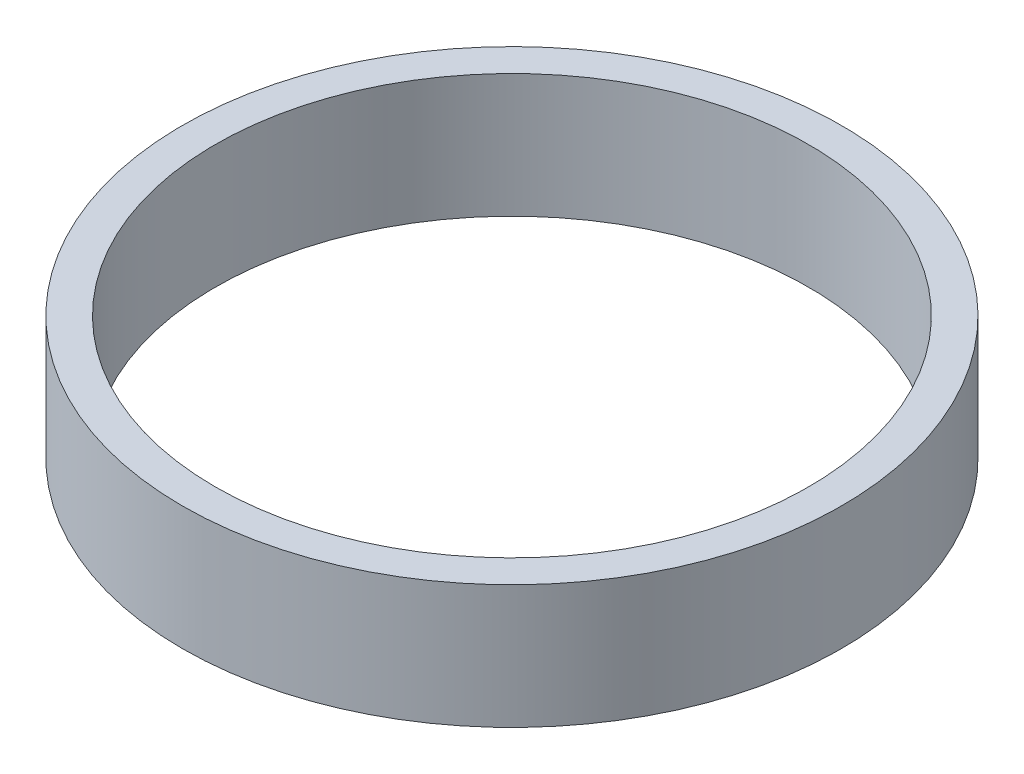
ISO-10303-21;
HEADER;
FILE_DESCRIPTION(('STEP AP214'),'2;1');
FILE_NAME('part.step','',(''),(''),'','','');
FILE_SCHEMA(('AUTOMOTIVE_DESIGN { 1 0 10303 214 1 1 1 1 }'));
ENDSEC;
DATA;
#1=APPLICATION_CONTEXT('core data for automotive mechanical design processes');
#2=APPLICATION_PROTOCOL_DEFINITION('international standard','automotive_design',2000,#1);
#3=PRODUCT_CONTEXT('',#1,'mechanical');
#4=PRODUCT('Part','Part','',(#3));
#5=PRODUCT_RELATED_PRODUCT_CATEGORY('part','',(#4));
#6=PRODUCT_DEFINITION_FORMATION('','',#4);
#7=PRODUCT_DEFINITION_CONTEXT('part definition',#1,'design');
#8=PRODUCT_DEFINITION('design','',#6,#7);
#9=PRODUCT_DEFINITION_SHAPE('','',#8);
#10=(LENGTH_UNIT() NAMED_UNIT(*) SI_UNIT(.MILLI.,.METRE.));
#11=(NAMED_UNIT(*) PLANE_ANGLE_UNIT() SI_UNIT($,.RADIAN.));
#12=(NAMED_UNIT(*) SI_UNIT($,.STERADIAN.) SOLID_ANGLE_UNIT());
#13=UNCERTAINTY_MEASURE_WITH_UNIT(LENGTH_MEASURE(1.E-05),#10,'distance_accuracy_value','');
#14=(GEOMETRIC_REPRESENTATION_CONTEXT(3) GLOBAL_UNCERTAINTY_ASSIGNED_CONTEXT((#13)) GLOBAL_UNIT_ASSIGNED_CONTEXT((#10,
#11,#12)) REPRESENTATION_CONTEXT('',''));
#15=CARTESIAN_POINT('',(0.,0.,0.));
#16=DIRECTION('',(0.,0.,1.));
#17=DIRECTION('',(1.,0.,0.));
#18=AXIS2_PLACEMENT_3D('',#15,#16,#17);
#19=CARTESIAN_POINT('',(0.,15.,0.));
#20=DIRECTION('',(0.,1.,0.));
#21=DIRECTION('',(0.,0.,1.));
#22=AXIS2_PLACEMENT_3D('',#19,#20,#21);
#23=PLANE('',#22);
#24=CARTESIAN_POINT('',(0.,15.,0.));
#25=DIRECTION('',(0.,1.,0.));
#26=DIRECTION('',(0.,0.,1.));
#27=AXIS2_PLACEMENT_3D('',#24,#25,#26);
#28=CIRCLE('',#27,40.);
#29=CARTESIAN_POINT('',(0.,15.,40.));
#30=VERTEX_POINT('',#29);
#31=EDGE_CURVE('E10',#30,#30,#28,.T.);
#32=ORIENTED_EDGE('',*,*,#31,.T.);
#33=EDGE_LOOP('',(#32));
#34=FACE_BOUND('',#33,.T.);
#35=CARTESIAN_POINT('',(0.,15.,0.));
#36=DIRECTION('',(0.,1.,0.));
#37=DIRECTION('',(0.,0.,1.));
#38=AXIS2_PLACEMENT_3D('',#35,#36,#37);
#39=CIRCLE('',#38,36.);
#40=CARTESIAN_POINT('',(0.,15.,36.));
#41=VERTEX_POINT('',#40);
#42=EDGE_CURVE('E46',#41,#41,#39,.T.);
#43=ORIENTED_EDGE('',*,*,#42,.F.);
#44=EDGE_LOOP('',(#43));
#45=FACE_BOUND('',#44,.T.);
#46=ADVANCED_FACE('F35',(#34,#45),#23,.T.);
#47=CARTESIAN_POINT('',(0.,0.,0.));
#48=DIRECTION('',(0.,1.,0.));
#49=DIRECTION('',(0.,0.,1.));
#50=AXIS2_PLACEMENT_3D('',#47,#48,#49);
#51=PLANE('',#50);
#52=CARTESIAN_POINT('',(0.,0.,0.));
#53=DIRECTION('',(0.,1.,0.));
#54=DIRECTION('',(0.,0.,1.));
#55=AXIS2_PLACEMENT_3D('',#52,#53,#54);
#56=CIRCLE('',#55,40.);
#57=CARTESIAN_POINT('',(0.,0.,40.));
#58=VERTEX_POINT('',#57);
#59=EDGE_CURVE('E39',#58,#58,#56,.T.);
#60=ORIENTED_EDGE('',*,*,#59,.F.);
#61=EDGE_LOOP('',(#60));
#62=FACE_BOUND('',#61,.T.);
#63=CARTESIAN_POINT('',(0.,0.,0.));
#64=DIRECTION('',(0.,1.,0.));
#65=DIRECTION('',(0.,0.,1.));
#66=AXIS2_PLACEMENT_3D('',#63,#64,#65);
#67=CIRCLE('',#66,36.);
#68=CARTESIAN_POINT('',(0.,0.,36.));
#69=VERTEX_POINT('',#68);
#70=EDGE_CURVE('E48',#69,#69,#67,.T.);
#71=ORIENTED_EDGE('',*,*,#70,.T.);
#72=EDGE_LOOP('',(#71));
#73=FACE_BOUND('',#72,.T.);
#74=ADVANCED_FACE('F58',(#62,#73),#51,.F.);
#75=CARTESIAN_POINT('',(0.,15.,0.));
#76=DIRECTION('',(0.,-1.,0.));
#77=DIRECTION('',(0.,0.,-1.));
#78=AXIS2_PLACEMENT_3D('',#75,#76,#77);
#79=CYLINDRICAL_SURFACE('',#78,40.);
#80=ORIENTED_EDGE('',*,*,#31,.F.);
#81=EDGE_LOOP('',(#80));
#82=FACE_BOUND('',#81,.T.);
#83=ORIENTED_EDGE('',*,*,#59,.T.);
#84=EDGE_LOOP('',(#83));
#85=FACE_BOUND('',#84,.T.);
#86=ADVANCED_FACE('F37',(#82,#85),#79,.T.);
#87=CARTESIAN_POINT('',(0.,15.,0.));
#88=DIRECTION('',(0.,-1.,0.));
#89=DIRECTION('',(0.,0.,-1.));
#90=AXIS2_PLACEMENT_3D('',#87,#88,#89);
#91=CYLINDRICAL_SURFACE('',#90,36.);
#92=ORIENTED_EDGE('',*,*,#42,.T.);
#93=EDGE_LOOP('',(#92));
#94=FACE_BOUND('',#93,.T.);
#95=ORIENTED_EDGE('',*,*,#70,.F.);
#96=EDGE_LOOP('',(#95));
#97=FACE_BOUND('',#96,.T.);
#98=ADVANCED_FACE('F54',(#94,#97),#91,.F.);
#99=CLOSED_SHELL('',(#46,#74,#86,#98));
#100=MANIFOLD_SOLID_BREP('B2',#99);
#101=ADVANCED_BREP_SHAPE_REPRESENTATION('',(#18,#100),#14);
#102=SHAPE_DEFINITION_REPRESENTATION(#9,#101);
ENDSEC;
END-ISO-10303-21;
